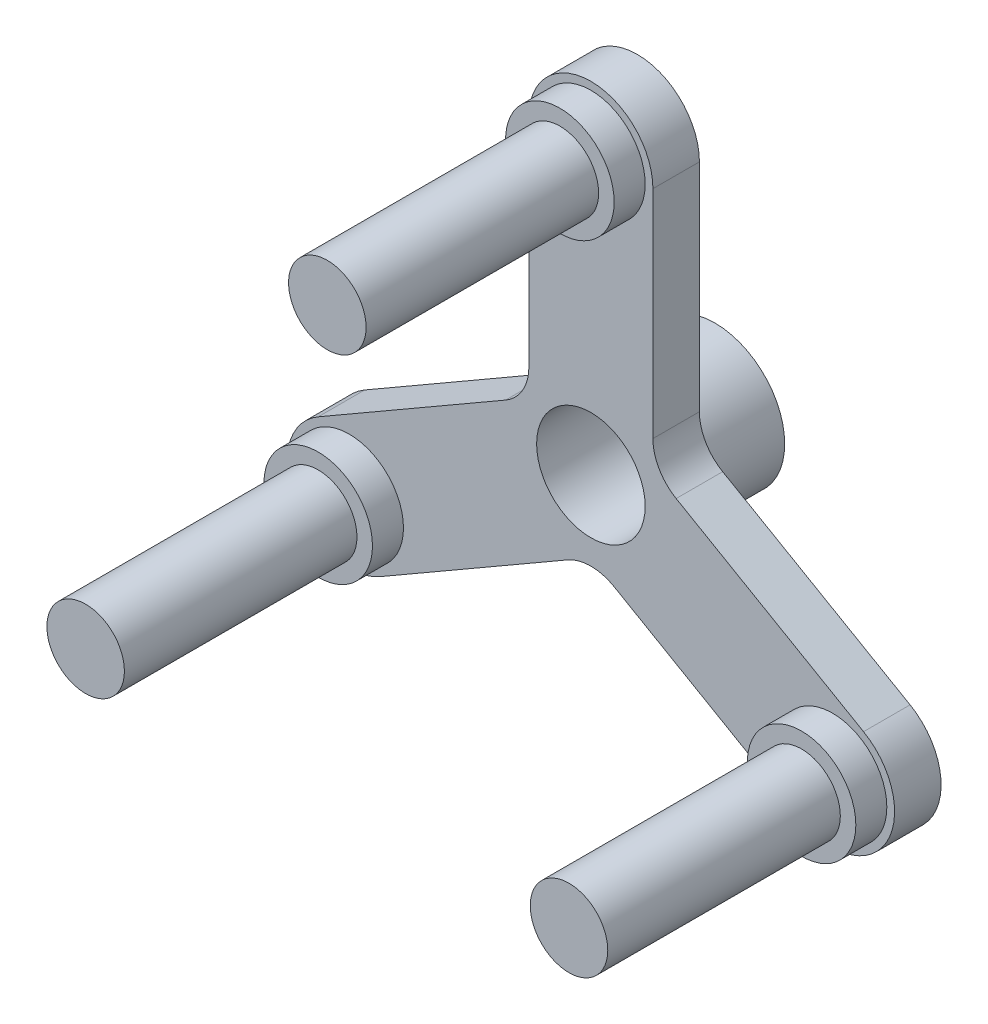
ISO-10303-21;
HEADER;
FILE_DESCRIPTION(('STEP AP214'),'2;1');
FILE_NAME('part.step','',(''),(''),'','','');
FILE_SCHEMA(('AUTOMOTIVE_DESIGN { 1 0 10303 214 1 1 1 1 }'));
ENDSEC;
DATA;
#1=APPLICATION_CONTEXT('core data for automotive mechanical design processes');
#2=APPLICATION_PROTOCOL_DEFINITION('international standard','automotive_design',2000,#1);
#3=PRODUCT_CONTEXT('',#1,'mechanical');
#4=PRODUCT('Part','Part','',(#3));
#5=PRODUCT_RELATED_PRODUCT_CATEGORY('part','',(#4));
#6=PRODUCT_DEFINITION_FORMATION('','',#4);
#7=PRODUCT_DEFINITION_CONTEXT('part definition',#1,'design');
#8=PRODUCT_DEFINITION('design','',#6,#7);
#9=PRODUCT_DEFINITION_SHAPE('','',#8);
#10=(LENGTH_UNIT() NAMED_UNIT(*) SI_UNIT(.MILLI.,.METRE.));
#11=(NAMED_UNIT(*) PLANE_ANGLE_UNIT() SI_UNIT($,.RADIAN.));
#12=(NAMED_UNIT(*) SI_UNIT($,.STERADIAN.) SOLID_ANGLE_UNIT());
#13=UNCERTAINTY_MEASURE_WITH_UNIT(LENGTH_MEASURE(1.E-05),#10,'distance_accuracy_value','');
#14=(GEOMETRIC_REPRESENTATION_CONTEXT(3) GLOBAL_UNCERTAINTY_ASSIGNED_CONTEXT((#13)) GLOBAL_UNIT_ASSIGNED_CONTEXT((#10,
#11,#12)) REPRESENTATION_CONTEXT('',''));
#15=CARTESIAN_POINT('',(0.,0.,0.));
#16=DIRECTION('',(0.,0.,1.));
#17=DIRECTION('',(1.,0.,0.));
#18=AXIS2_PLACEMENT_3D('',#15,#16,#17);
#19=CARTESIAN_POINT('',(0.,0.,0.));
#20=DIRECTION('',(0.,0.,1.));
#21=DIRECTION('',(1.,0.,0.));
#22=AXIS2_PLACEMENT_3D('',#19,#20,#21);
#23=PLANE('',#22);
#24=DIRECTION('',(-0.866025403784436,-0.500000000000004,0.));
#25=VECTOR('',#24,1.);
#26=CARTESIAN_POINT('',(-2.00000000000002,3.46410161513775,0.));
#27=LINE('',#26,#25);
#28=CARTESIAN_POINT('',(-5.49999999999999,1.44337567297405,0.));
#29=VERTEX_POINT('',#28);
#30=CARTESIAN_POINT('',(-17.5884572681199,-5.53589838486233,0.));
#31=VERTEX_POINT('',#30);
#32=EDGE_CURVE('E147',#29,#31,#27,.T.);
#33=ORIENTED_EDGE('',*,*,#32,.F.);
#34=CARTESIAN_POINT('',(-7.,4.04145188432736,0.));
#35=DIRECTION('',(0.,0.,1.));
#36=DIRECTION('',(1.,0.,0.));
#37=AXIS2_PLACEMENT_3D('',#34,#35,#36);
#38=CIRCLE('',#37,3.);
#39=CARTESIAN_POINT('',(-4.,4.04145188432736,0.));
#40=VERTEX_POINT('',#39);
#41=EDGE_CURVE('E49',#29,#40,#38,.T.);
#42=ORIENTED_EDGE('',*,*,#41,.T.);
#43=DIRECTION('',(0.,-1.,0.));
#44=VECTOR('',#43,1.);
#45=CARTESIAN_POINT('',(-4.,0.,0.));
#46=LINE('',#45,#44);
#47=CARTESIAN_POINT('',(-4.,18.,0.));
#48=VERTEX_POINT('',#47);
#49=EDGE_CURVE('E204',#48,#40,#46,.T.);
#50=ORIENTED_EDGE('',*,*,#49,.F.);
#51=CARTESIAN_POINT('',(0.,18.,0.));
#52=DIRECTION('',(0.,0.,1.));
#53=DIRECTION('',(1.,0.,0.));
#54=AXIS2_PLACEMENT_3D('',#51,#52,#53);
#55=CIRCLE('',#54,4.);
#56=CARTESIAN_POINT('',(4.,18.,0.));
#57=VERTEX_POINT('',#56);
#58=EDGE_CURVE('E210',#57,#48,#55,.T.);
#59=ORIENTED_EDGE('',*,*,#58,.F.);
#60=DIRECTION('',(0.,1.,0.));
#61=VECTOR('',#60,1.);
#62=CARTESIAN_POINT('',(4.,0.,0.));
#63=LINE('',#62,#61);
#64=CARTESIAN_POINT('',(4.,4.04145188432742,0.));
#65=VERTEX_POINT('',#64);
#66=EDGE_CURVE('E200',#65,#57,#63,.T.);
#67=ORIENTED_EDGE('',*,*,#66,.F.);
#68=CARTESIAN_POINT('',(7.,4.04145188432742,0.));
#69=DIRECTION('',(0.,0.,1.));
#70=DIRECTION('',(1.,0.,0.));
#71=AXIS2_PLACEMENT_3D('',#68,#69,#70);
#72=CIRCLE('',#71,3.);
#73=CARTESIAN_POINT('',(5.50000000000003,1.44337567297409,0.));
#74=VERTEX_POINT('',#73);
#75=EDGE_CURVE('E233',#65,#74,#72,.T.);
#76=ORIENTED_EDGE('',*,*,#75,.T.);
#77=DIRECTION('',(-0.866025403784443,0.499999999999992,0.));
#78=VECTOR('',#77,1.);
#79=CARTESIAN_POINT('',(1.99999999999997,3.46410161513777,0.));
#80=LINE('',#79,#78);
#81=CARTESIAN_POINT('',(17.5884572681199,-5.53589838486208,0.));
#82=VERTEX_POINT('',#81);
#83=EDGE_CURVE('E138',#82,#74,#80,.T.);
#84=ORIENTED_EDGE('',*,*,#83,.F.);
#85=CARTESIAN_POINT('',(15.58845726812,-8.99999999999985,0.));
#86=DIRECTION('',(0.,0.,1.));
#87=DIRECTION('',(-0.499999999999992,-0.866025403784443,0.));
#88=AXIS2_PLACEMENT_3D('',#85,#86,#87);
#89=CIRCLE('',#88,4.);
#90=CARTESIAN_POINT('',(13.58845726812,-12.4641016151376,0.));
#91=VERTEX_POINT('',#90);
#92=EDGE_CURVE('E159',#91,#82,#89,.T.);
#93=ORIENTED_EDGE('',*,*,#92,.F.);
#94=DIRECTION('',(0.866025403784443,-0.499999999999992,0.));
#95=VECTOR('',#94,1.);
#96=CARTESIAN_POINT('',(-1.99999999999997,-3.46410161513777,0.));
#97=LINE('',#96,#95);
#98=CARTESIAN_POINT('',(1.50000000000003,-5.48482755730142,0.));
#99=VERTEX_POINT('',#98);
#100=EDGE_CURVE('E144',#99,#91,#97,.T.);
#101=ORIENTED_EDGE('',*,*,#100,.F.);
#102=CARTESIAN_POINT('',(0.,-8.08290376865475,0.));
#103=DIRECTION('',(0.,0.,1.));
#104=DIRECTION('',(1.,0.,0.));
#105=AXIS2_PLACEMENT_3D('',#102,#103,#104);
#106=CIRCLE('',#105,3.);
#107=CARTESIAN_POINT('',(-1.49999999999996,-5.48482755730144,0.));
#108=VERTEX_POINT('',#107);
#109=EDGE_CURVE('E235',#99,#108,#106,.T.);
#110=ORIENTED_EDGE('',*,*,#109,.T.);
#111=DIRECTION('',(0.866025403784436,0.500000000000004,0.));
#112=VECTOR('',#111,1.);
#113=CARTESIAN_POINT('',(2.00000000000002,-3.46410161513775,0.));
#114=LINE('',#113,#112);
#115=CARTESIAN_POINT('',(-13.5884572681198,-12.4641016151378,0.));
#116=VERTEX_POINT('',#115);
#117=EDGE_CURVE('E168',#116,#108,#114,.T.);
#118=ORIENTED_EDGE('',*,*,#117,.F.);
#119=CARTESIAN_POINT('',(-15.5884572681199,-9.00000000000007,0.));
#120=DIRECTION('',(0.,0.,1.));
#121=DIRECTION('',(-0.500000000000004,0.866025403784436,0.));
#122=AXIS2_PLACEMENT_3D('',#119,#120,#121);
#123=CIRCLE('',#122,4.);
#124=EDGE_CURVE('E174',#31,#116,#123,.T.);
#125=ORIENTED_EDGE('',*,*,#124,.F.);
#126=EDGE_LOOP('',(#33,#42,#50,#59,#67,#76,#84,#93,#101,#110,#118,#125));
#127=FACE_BOUND('',#126,.T.);
#128=CARTESIAN_POINT('',(0.,0.,0.));
#129=DIRECTION('',(0.,0.,1.));
#130=DIRECTION('',(1.,0.,0.));
#131=AXIS2_PLACEMENT_3D('',#128,#129,#130);
#132=CIRCLE('',#131,4.5);
#133=CARTESIAN_POINT('',(4.5,0.,0.));
#134=VERTEX_POINT('',#133);
#135=EDGE_CURVE('E11',#134,#134,#132,.F.);
#136=ORIENTED_EDGE('',*,*,#135,.F.);
#137=EDGE_LOOP('',(#136));
#138=FACE_BOUND('',#137,.T.);
#139=ADVANCED_FACE('F34',(#127,#138),#23,.F.);
#140=CARTESIAN_POINT('',(4.,0.,3.));
#141=DIRECTION('',(-1.,0.,0.));
#142=DIRECTION('',(0.,0.,1.));
#143=AXIS2_PLACEMENT_3D('',#140,#141,#142);
#144=PLANE('',#143);
#145=DIRECTION('',(0.,1.,0.));
#146=VECTOR('',#145,1.);
#147=CARTESIAN_POINT('',(4.,0.,3.));
#148=LINE('',#147,#146);
#149=CARTESIAN_POINT('',(4.,4.04145188432742,3.));
#150=VERTEX_POINT('',#149);
#151=CARTESIAN_POINT('',(4.,18.,3.));
#152=VERTEX_POINT('',#151);
#153=EDGE_CURVE('E201',#150,#152,#148,.T.);
#154=ORIENTED_EDGE('',*,*,#153,.F.);
#155=DIRECTION('',(0.,0.,1.));
#156=VECTOR('',#155,1.);
#157=CARTESIAN_POINT('',(4.,4.04145188432742,0.));
#158=LINE('',#157,#156);
#159=EDGE_CURVE('E220',#150,#65,#158,.F.);
#160=ORIENTED_EDGE('',*,*,#159,.T.);
#161=ORIENTED_EDGE('',*,*,#66,.T.);
#162=DIRECTION('',(0.,0.,-1.));
#163=VECTOR('',#162,1.);
#164=CARTESIAN_POINT('',(4.,18.,3.));
#165=LINE('',#164,#163);
#166=EDGE_CURVE('E191',#152,#57,#165,.T.);
#167=ORIENTED_EDGE('',*,*,#166,.F.);
#168=EDGE_LOOP('',(#154,#160,#161,#167));
#169=FACE_BOUND('',#168,.T.);
#170=ADVANCED_FACE('F259',(#169),#144,.F.);
#171=CARTESIAN_POINT('',(-4.,0.,3.));
#172=DIRECTION('',(1.,0.,0.));
#173=DIRECTION('',(0.,0.,-1.));
#174=AXIS2_PLACEMENT_3D('',#171,#172,#173);
#175=PLANE('',#174);
#176=ORIENTED_EDGE('',*,*,#49,.T.);
#177=DIRECTION('',(0.,0.,-1.));
#178=VECTOR('',#177,1.);
#179=CARTESIAN_POINT('',(-4.,4.04145188432736,3.));
#180=LINE('',#179,#178);
#181=CARTESIAN_POINT('',(-4.,4.04145188432736,3.));
#182=VERTEX_POINT('',#181);
#183=EDGE_CURVE('E56',#40,#182,#180,.F.);
#184=ORIENTED_EDGE('',*,*,#183,.T.);
#185=DIRECTION('',(0.,-1.,0.));
#186=VECTOR('',#185,1.);
#187=CARTESIAN_POINT('',(-4.,0.,3.));
#188=LINE('',#187,#186);
#189=CARTESIAN_POINT('',(-4.,18.,3.));
#190=VERTEX_POINT('',#189);
#191=EDGE_CURVE('E206',#190,#182,#188,.T.);
#192=ORIENTED_EDGE('',*,*,#191,.F.);
#193=DIRECTION('',(0.,0.,-1.));
#194=VECTOR('',#193,1.);
#195=CARTESIAN_POINT('',(-4.,18.,3.));
#196=LINE('',#195,#194);
#197=EDGE_CURVE('E208',#190,#48,#196,.T.);
#198=ORIENTED_EDGE('',*,*,#197,.T.);
#199=EDGE_LOOP('',(#176,#184,#192,#198));
#200=FACE_BOUND('',#199,.T.);
#201=ADVANCED_FACE('F264',(#200),#175,.F.);
#202=CARTESIAN_POINT('',(0.,0.,3.));
#203=DIRECTION('',(0.,0.,1.));
#204=DIRECTION('',(1.,0.,0.));
#205=AXIS2_PLACEMENT_3D('',#202,#203,#204);
#206=PLANE('',#205);
#207=CARTESIAN_POINT('',(15.58845726812,-8.99999999999985,3.));
#208=DIRECTION('',(0.,0.,1.));
#209=DIRECTION('',(-0.499999999999992,-0.866025403784443,0.));
#210=AXIS2_PLACEMENT_3D('',#207,#208,#209);
#211=CIRCLE('',#210,3.5);
#212=CARTESIAN_POINT('',(13.83845726812,-12.0310889132454,3.));
#213=VERTEX_POINT('',#212);
#214=EDGE_CURVE('E359',#213,#213,#211,.T.);
#215=ORIENTED_EDGE('',*,*,#214,.F.);
#216=EDGE_LOOP('',(#215));
#217=FACE_BOUND('',#216,.T.);
#218=CARTESIAN_POINT('',(-15.5884572681199,-9.00000000000007,3.));
#219=DIRECTION('',(0.,0.,1.));
#220=DIRECTION('',(-0.500000000000004,0.866025403784436,0.));
#221=AXIS2_PLACEMENT_3D('',#218,#219,#220);
#222=CIRCLE('',#221,3.5);
#223=CARTESIAN_POINT('',(-17.3384572681199,-5.96891108675455,3.));
#224=VERTEX_POINT('',#223);
#225=EDGE_CURVE('E365',#224,#224,#222,.T.);
#226=ORIENTED_EDGE('',*,*,#225,.F.);
#227=EDGE_LOOP('',(#226));
#228=FACE_BOUND('',#227,.T.);
#229=DIRECTION('',(-0.866025403784443,0.499999999999992,0.));
#230=VECTOR('',#229,1.);
#231=CARTESIAN_POINT('',(1.99999999999997,3.46410161513777,3.));
#232=LINE('',#231,#230);
#233=CARTESIAN_POINT('',(17.5884572681199,-5.53589838486208,3.));
#234=VERTEX_POINT('',#233);
#235=CARTESIAN_POINT('',(5.50000000000003,1.44337567297409,3.));
#236=VERTEX_POINT('',#235);
#237=EDGE_CURVE('E153',#234,#236,#232,.T.);
#238=ORIENTED_EDGE('',*,*,#237,.T.);
#239=CARTESIAN_POINT('',(7.,4.04145188432742,3.));
#240=DIRECTION('',(0.,0.,1.));
#241=DIRECTION('',(1.,0.,0.));
#242=AXIS2_PLACEMENT_3D('',#239,#240,#241);
#243=CIRCLE('',#242,3.);
#244=EDGE_CURVE('E231',#236,#150,#243,.F.);
#245=ORIENTED_EDGE('',*,*,#244,.T.);
#246=ORIENTED_EDGE('',*,*,#153,.T.);
#247=CARTESIAN_POINT('',(0.,18.,3.));
#248=DIRECTION('',(0.,0.,1.));
#249=DIRECTION('',(1.,0.,0.));
#250=AXIS2_PLACEMENT_3D('',#247,#248,#249);
#251=CIRCLE('',#250,4.);
#252=EDGE_CURVE('E203',#152,#190,#251,.T.);
#253=ORIENTED_EDGE('',*,*,#252,.T.);
#254=ORIENTED_EDGE('',*,*,#191,.T.);
#255=CARTESIAN_POINT('',(-7.,4.04145188432736,3.));
#256=DIRECTION('',(0.,0.,1.));
#257=DIRECTION('',(1.,0.,0.));
#258=AXIS2_PLACEMENT_3D('',#255,#256,#257);
#259=CIRCLE('',#258,3.);
#260=CARTESIAN_POINT('',(-5.49999999999999,1.44337567297405,3.));
#261=VERTEX_POINT('',#260);
#262=EDGE_CURVE('E42',#182,#261,#259,.F.);
#263=ORIENTED_EDGE('',*,*,#262,.T.);
#264=DIRECTION('',(-0.866025403784436,-0.500000000000004,0.));
#265=VECTOR('',#264,1.);
#266=CARTESIAN_POINT('',(-2.00000000000002,3.46410161513775,3.));
#267=LINE('',#266,#265);
#268=CARTESIAN_POINT('',(-17.5884572681199,-5.53589838486233,3.));
#269=VERTEX_POINT('',#268);
#270=EDGE_CURVE('E165',#261,#269,#267,.T.);
#271=ORIENTED_EDGE('',*,*,#270,.T.);
#272=CARTESIAN_POINT('',(-15.5884572681199,-9.00000000000007,3.));
#273=DIRECTION('',(0.,0.,1.));
#274=DIRECTION('',(-0.500000000000004,0.866025403784436,0.));
#275=AXIS2_PLACEMENT_3D('',#272,#273,#274);
#276=CIRCLE('',#275,4.);
#277=CARTESIAN_POINT('',(-13.5884572681198,-12.4641016151378,3.));
#278=VERTEX_POINT('',#277);
#279=EDGE_CURVE('E167',#269,#278,#276,.T.);
#280=ORIENTED_EDGE('',*,*,#279,.T.);
#281=DIRECTION('',(0.866025403784436,0.500000000000004,0.));
#282=VECTOR('',#281,1.);
#283=CARTESIAN_POINT('',(2.00000000000002,-3.46410161513775,3.));
#284=LINE('',#283,#282);
#285=CARTESIAN_POINT('',(-1.49999999999996,-5.48482755730144,3.));
#286=VERTEX_POINT('',#285);
#287=EDGE_CURVE('E170',#278,#286,#284,.T.);
#288=ORIENTED_EDGE('',*,*,#287,.T.);
#289=CARTESIAN_POINT('',(0.,-8.08290376865475,3.));
#290=DIRECTION('',(0.,0.,1.));
#291=DIRECTION('',(1.,0.,0.));
#292=AXIS2_PLACEMENT_3D('',#289,#290,#291);
#293=CIRCLE('',#292,3.);
#294=CARTESIAN_POINT('',(1.50000000000003,-5.48482755730142,3.));
#295=VERTEX_POINT('',#294);
#296=EDGE_CURVE('E134',#286,#295,#293,.F.);
#297=ORIENTED_EDGE('',*,*,#296,.T.);
#298=DIRECTION('',(0.866025403784443,-0.499999999999992,0.));
#299=VECTOR('',#298,1.);
#300=CARTESIAN_POINT('',(-1.99999999999997,-3.46410161513777,3.));
#301=LINE('',#300,#299);
#302=CARTESIAN_POINT('',(13.58845726812,-12.4641016151376,3.));
#303=VERTEX_POINT('',#302);
#304=EDGE_CURVE('E124',#295,#303,#301,.T.);
#305=ORIENTED_EDGE('',*,*,#304,.T.);
#306=CARTESIAN_POINT('',(15.58845726812,-8.99999999999985,3.));
#307=DIRECTION('',(0.,0.,1.));
#308=DIRECTION('',(-0.499999999999992,-0.866025403784443,0.));
#309=AXIS2_PLACEMENT_3D('',#306,#307,#308);
#310=CIRCLE('',#309,4.);
#311=EDGE_CURVE('E130',#303,#234,#310,.T.);
#312=ORIENTED_EDGE('',*,*,#311,.T.);
#313=EDGE_LOOP('',(#238,#245,#246,#253,#254,#263,#271,#280,#288,#297,#305,#312));
#314=FACE_BOUND('',#313,.T.);
#315=CARTESIAN_POINT('',(0.,0.,3.));
#316=DIRECTION('',(0.,0.,1.));
#317=DIRECTION('',(1.,0.,0.));
#318=AXIS2_PLACEMENT_3D('',#315,#316,#317);
#319=CIRCLE('',#318,3.5);
#320=CARTESIAN_POINT('',(3.5,0.,3.));
#321=VERTEX_POINT('',#320);
#322=EDGE_CURVE('E195',#321,#321,#319,.T.);
#323=ORIENTED_EDGE('',*,*,#322,.F.);
#324=EDGE_LOOP('',(#323));
#325=FACE_BOUND('',#324,.T.);
#326=CARTESIAN_POINT('',(0.,18.,3.));
#327=DIRECTION('',(0.,0.,1.));
#328=DIRECTION('',(1.,0.,0.));
#329=AXIS2_PLACEMENT_3D('',#326,#327,#328);
#330=CIRCLE('',#329,3.5);
#331=CARTESIAN_POINT('',(3.5,18.,3.));
#332=VERTEX_POINT('',#331);
#333=EDGE_CURVE('E186',#332,#332,#330,.T.);
#334=ORIENTED_EDGE('',*,*,#333,.F.);
#335=EDGE_LOOP('',(#334));
#336=FACE_BOUND('',#335,.T.);
#337=ADVANCED_FACE('F127',(#217,#228,#314,#325,#336),#206,.T.);
#338=CARTESIAN_POINT('',(0.,18.,3.));
#339=DIRECTION('',(0.,0.,-1.));
#340=DIRECTION('',(-1.,0.,0.));
#341=AXIS2_PLACEMENT_3D('',#338,#339,#340);
#342=CYLINDRICAL_SURFACE('',#341,4.);
#343=ORIENTED_EDGE('',*,*,#58,.T.);
#344=ORIENTED_EDGE('',*,*,#197,.F.);
#345=ORIENTED_EDGE('',*,*,#252,.F.);
#346=ORIENTED_EDGE('',*,*,#166,.T.);
#347=EDGE_LOOP('',(#343,#344,#345,#346));
#348=FACE_BOUND('',#347,.T.);
#349=ADVANCED_FACE('F273',(#348),#342,.T.);
#350=CARTESIAN_POINT('',(0.,0.,3.));
#351=DIRECTION('',(0.,0.,-1.));
#352=DIRECTION('',(-1.,0.,0.));
#353=AXIS2_PLACEMENT_3D('',#350,#351,#352);
#354=CYLINDRICAL_SURFACE('',#353,3.5);
#355=ORIENTED_EDGE('',*,*,#322,.T.);
#356=EDGE_LOOP('',(#355));
#357=FACE_BOUND('',#356,.T.);
#358=CARTESIAN_POINT('',(0.,0.,-5.));
#359=DIRECTION('',(0.,0.,-1.));
#360=DIRECTION('',(-1.,0.,0.));
#361=AXIS2_PLACEMENT_3D('',#358,#359,#360);
#362=CIRCLE('',#361,3.5);
#363=CARTESIAN_POINT('',(-3.5,0.,-5.));
#364=VERTEX_POINT('',#363);
#365=EDGE_CURVE('E344',#364,#364,#362,.T.);
#366=ORIENTED_EDGE('',*,*,#365,.T.);
#367=EDGE_LOOP('',(#366));
#368=FACE_BOUND('',#367,.T.);
#369=ADVANCED_FACE('F275',(#357,#368),#354,.F.);
#370=CARTESIAN_POINT('',(0.,18.,5.));
#371=DIRECTION('',(0.,0.,-1.));
#372=DIRECTION('',(-1.,0.,0.));
#373=AXIS2_PLACEMENT_3D('',#370,#371,#372);
#374=CYLINDRICAL_SURFACE('',#373,3.5);
#375=CARTESIAN_POINT('',(0.,18.,5.));
#376=DIRECTION('',(0.,0.,1.));
#377=DIRECTION('',(1.,0.,0.));
#378=AXIS2_PLACEMENT_3D('',#375,#376,#377);
#379=CIRCLE('',#378,3.5);
#380=CARTESIAN_POINT('',(3.5,18.,5.));
#381=VERTEX_POINT('',#380);
#382=EDGE_CURVE('E192',#381,#381,#379,.T.);
#383=ORIENTED_EDGE('',*,*,#382,.F.);
#384=EDGE_LOOP('',(#383));
#385=FACE_BOUND('',#384,.T.);
#386=ORIENTED_EDGE('',*,*,#333,.T.);
#387=EDGE_LOOP('',(#386));
#388=FACE_BOUND('',#387,.T.);
#389=ADVANCED_FACE('F332',(#385,#388),#374,.T.);
#390=CARTESIAN_POINT('',(0.,18.,5.));
#391=DIRECTION('',(0.,0.,1.));
#392=DIRECTION('',(1.,0.,0.));
#393=AXIS2_PLACEMENT_3D('',#390,#391,#392);
#394=PLANE('',#393);
#395=CARTESIAN_POINT('',(0.,18.,5.));
#396=DIRECTION('',(0.,0.,1.));
#397=DIRECTION('',(1.,0.,0.));
#398=AXIS2_PLACEMENT_3D('',#395,#396,#397);
#399=CIRCLE('',#398,2.5);
#400=CARTESIAN_POINT('',(2.5,18.,5.));
#401=VERTEX_POINT('',#400);
#402=EDGE_CURVE('E187',#401,#401,#399,.T.);
#403=ORIENTED_EDGE('',*,*,#402,.F.);
#404=EDGE_LOOP('',(#403));
#405=FACE_BOUND('',#404,.T.);
#406=ORIENTED_EDGE('',*,*,#382,.T.);
#407=EDGE_LOOP('',(#406));
#408=FACE_BOUND('',#407,.T.);
#409=ADVANCED_FACE('F328',(#405,#408),#394,.T.);
#410=CARTESIAN_POINT('',(0.,18.,20.));
#411=DIRECTION('',(0.,0.,-1.));
#412=DIRECTION('',(-1.,0.,0.));
#413=AXIS2_PLACEMENT_3D('',#410,#411,#412);
#414=CYLINDRICAL_SURFACE('',#413,2.5);
#415=CARTESIAN_POINT('',(0.,18.,20.));
#416=DIRECTION('',(0.,0.,1.));
#417=DIRECTION('',(1.,0.,0.));
#418=AXIS2_PLACEMENT_3D('',#415,#416,#417);
#419=CIRCLE('',#418,2.5);
#420=CARTESIAN_POINT('',(2.5,18.,20.));
#421=VERTEX_POINT('',#420);
#422=EDGE_CURVE('E183',#421,#421,#419,.T.);
#423=ORIENTED_EDGE('',*,*,#422,.F.);
#424=EDGE_LOOP('',(#423));
#425=FACE_BOUND('',#424,.T.);
#426=ORIENTED_EDGE('',*,*,#402,.T.);
#427=EDGE_LOOP('',(#426));
#428=FACE_BOUND('',#427,.T.);
#429=ADVANCED_FACE('F308',(#425,#428),#414,.T.);
#430=CARTESIAN_POINT('',(0.,18.,20.));
#431=DIRECTION('',(0.,0.,1.));
#432=DIRECTION('',(1.,0.,0.));
#433=AXIS2_PLACEMENT_3D('',#430,#431,#432);
#434=PLANE('',#433);
#435=ORIENTED_EDGE('',*,*,#422,.T.);
#436=EDGE_LOOP('',(#435));
#437=FACE_BOUND('',#436,.T.);
#438=ADVANCED_FACE('F300',(#437),#434,.T.);
#439=CARTESIAN_POINT('',(1.99999999999997,3.46410161513777,3.));
#440=DIRECTION('',(-0.499999999999992,-0.866025403784443,0.));
#441=DIRECTION('',(0.866025403784443,-0.499999999999992,0.));
#442=AXIS2_PLACEMENT_3D('',#439,#440,#441);
#443=PLANE('',#442);
#444=ORIENTED_EDGE('',*,*,#83,.T.);
#445=DIRECTION('',(0.,0.,1.));
#446=VECTOR('',#445,1.);
#447=CARTESIAN_POINT('',(5.50000000000003,1.44337567297409,3.));
#448=LINE('',#447,#446);
#449=EDGE_CURVE('E217',#74,#236,#448,.T.);
#450=ORIENTED_EDGE('',*,*,#449,.T.);
#451=ORIENTED_EDGE('',*,*,#237,.F.);
#452=DIRECTION('',(0.,0.,-1.));
#453=VECTOR('',#452,1.);
#454=CARTESIAN_POINT('',(17.5884572681199,-5.53589838486208,3.));
#455=LINE('',#454,#453);
#456=EDGE_CURVE('E148',#234,#82,#455,.T.);
#457=ORIENTED_EDGE('',*,*,#456,.T.);
#458=EDGE_LOOP('',(#444,#450,#451,#457));
#459=FACE_BOUND('',#458,.T.);
#460=ADVANCED_FACE('F294',(#459),#443,.F.);
#461=CARTESIAN_POINT('',(-2.00000000000002,3.46410161513775,3.));
#462=DIRECTION('',(0.500000000000004,-0.866025403784436,0.));
#463=DIRECTION('',(0.866025403784436,0.500000000000004,0.));
#464=AXIS2_PLACEMENT_3D('',#461,#462,#463);
#465=PLANE('',#464);
#466=ORIENTED_EDGE('',*,*,#270,.F.);
#467=DIRECTION('',(0.,0.,-1.));
#468=VECTOR('',#467,1.);
#469=CARTESIAN_POINT('',(-5.49999999999999,1.44337567297405,0.));
#470=LINE('',#469,#468);
#471=EDGE_CURVE('E227',#261,#29,#470,.T.);
#472=ORIENTED_EDGE('',*,*,#471,.T.);
#473=ORIENTED_EDGE('',*,*,#32,.T.);
#474=DIRECTION('',(0.,0.,-1.));
#475=VECTOR('',#474,1.);
#476=CARTESIAN_POINT('',(-17.5884572681199,-5.53589838486233,3.));
#477=LINE('',#476,#475);
#478=EDGE_CURVE('E180',#269,#31,#477,.T.);
#479=ORIENTED_EDGE('',*,*,#478,.F.);
#480=EDGE_LOOP('',(#466,#472,#473,#479));
#481=FACE_BOUND('',#480,.T.);
#482=ADVANCED_FACE('F244',(#481),#465,.F.);
#483=CARTESIAN_POINT('',(2.00000000000002,-3.46410161513775,3.));
#484=DIRECTION('',(-0.500000000000004,0.866025403784436,0.));
#485=DIRECTION('',(-0.866025403784436,-0.500000000000004,0.));
#486=AXIS2_PLACEMENT_3D('',#483,#484,#485);
#487=PLANE('',#486);
#488=ORIENTED_EDGE('',*,*,#117,.T.);
#489=DIRECTION('',(0.,0.,-1.));
#490=VECTOR('',#489,1.);
#491=CARTESIAN_POINT('',(-1.49999999999995,-5.48482755730144,3.));
#492=LINE('',#491,#490);
#493=EDGE_CURVE('E225',#108,#286,#492,.F.);
#494=ORIENTED_EDGE('',*,*,#493,.T.);
#495=ORIENTED_EDGE('',*,*,#287,.F.);
#496=DIRECTION('',(0.,0.,-1.));
#497=VECTOR('',#496,1.);
#498=CARTESIAN_POINT('',(-13.5884572681198,-12.4641016151378,3.));
#499=LINE('',#498,#497);
#500=EDGE_CURVE('E172',#278,#116,#499,.T.);
#501=ORIENTED_EDGE('',*,*,#500,.T.);
#502=EDGE_LOOP('',(#488,#494,#495,#501));
#503=FACE_BOUND('',#502,.T.);
#504=ADVANCED_FACE('F306',(#503),#487,.F.);
#505=CARTESIAN_POINT('',(-15.5884572681199,-9.00000000000007,3.));
#506=DIRECTION('',(0.,0.,-1.));
#507=DIRECTION('',(-1.,0.,0.));
#508=AXIS2_PLACEMENT_3D('',#505,#506,#507);
#509=CYLINDRICAL_SURFACE('',#508,4.);
#510=ORIENTED_EDGE('',*,*,#124,.T.);
#511=ORIENTED_EDGE('',*,*,#500,.F.);
#512=ORIENTED_EDGE('',*,*,#279,.F.);
#513=ORIENTED_EDGE('',*,*,#478,.T.);
#514=EDGE_LOOP('',(#510,#511,#512,#513));
#515=FACE_BOUND('',#514,.T.);
#516=ADVANCED_FACE('F319',(#515),#509,.T.);
#517=CARTESIAN_POINT('',(-1.99999999999997,-3.46410161513777,3.));
#518=DIRECTION('',(0.499999999999992,0.866025403784443,0.));
#519=DIRECTION('',(-0.866025403784443,0.499999999999992,0.));
#520=AXIS2_PLACEMENT_3D('',#517,#518,#519);
#521=PLANE('',#520);
#522=ORIENTED_EDGE('',*,*,#304,.F.);
#523=DIRECTION('',(0.,0.,-1.));
#524=VECTOR('',#523,1.);
#525=CARTESIAN_POINT('',(1.50000000000003,-5.48482755730142,0.));
#526=LINE('',#525,#524);
#527=EDGE_CURVE('E223',#295,#99,#526,.T.);
#528=ORIENTED_EDGE('',*,*,#527,.T.);
#529=ORIENTED_EDGE('',*,*,#100,.T.);
#530=DIRECTION('',(0.,0.,-1.));
#531=VECTOR('',#530,1.);
#532=CARTESIAN_POINT('',(13.58845726812,-12.4641016151376,3.));
#533=LINE('',#532,#531);
#534=EDGE_CURVE('E141',#303,#91,#533,.T.);
#535=ORIENTED_EDGE('',*,*,#534,.F.);
#536=EDGE_LOOP('',(#522,#528,#529,#535));
#537=FACE_BOUND('',#536,.T.);
#538=ADVANCED_FACE('F142',(#537),#521,.F.);
#539=CARTESIAN_POINT('',(15.58845726812,-8.99999999999985,3.));
#540=DIRECTION('',(0.,0.,-1.));
#541=DIRECTION('',(-1.,0.,0.));
#542=AXIS2_PLACEMENT_3D('',#539,#540,#541);
#543=CYLINDRICAL_SURFACE('',#542,4.);
#544=ORIENTED_EDGE('',*,*,#92,.T.);
#545=ORIENTED_EDGE('',*,*,#456,.F.);
#546=ORIENTED_EDGE('',*,*,#311,.F.);
#547=ORIENTED_EDGE('',*,*,#534,.T.);
#548=EDGE_LOOP('',(#544,#545,#546,#547));
#549=FACE_BOUND('',#548,.T.);
#550=ADVANCED_FACE('F150',(#549),#543,.T.);
#551=CARTESIAN_POINT('',(-15.5884572681199,-9.00000000000007,5.));
#552=DIRECTION('',(0.,0.,-1.));
#553=DIRECTION('',(-1.,0.,0.));
#554=AXIS2_PLACEMENT_3D('',#551,#552,#553);
#555=CYLINDRICAL_SURFACE('',#554,3.5);
#556=CARTESIAN_POINT('',(-15.5884572681199,-9.00000000000007,5.));
#557=DIRECTION('',(0.,0.,1.));
#558=DIRECTION('',(-0.500000000000004,0.866025403784436,0.));
#559=AXIS2_PLACEMENT_3D('',#556,#557,#558);
#560=CIRCLE('',#559,3.5);
#561=CARTESIAN_POINT('',(-17.3384572681199,-5.96891108675455,5.));
#562=VERTEX_POINT('',#561);
#563=EDGE_CURVE('E160',#562,#562,#560,.T.);
#564=ORIENTED_EDGE('',*,*,#563,.F.);
#565=EDGE_LOOP('',(#564));
#566=FACE_BOUND('',#565,.T.);
#567=ORIENTED_EDGE('',*,*,#225,.T.);
#568=EDGE_LOOP('',(#567));
#569=FACE_BOUND('',#568,.T.);
#570=ADVANCED_FACE('F313',(#566,#569),#555,.T.);
#571=CARTESIAN_POINT('',(-15.5884572681199,-9.00000000000007,5.));
#572=DIRECTION('',(0.,0.,1.));
#573=DIRECTION('',(-0.500000000000004,0.866025403784436,0.));
#574=AXIS2_PLACEMENT_3D('',#571,#572,#573);
#575=PLANE('',#574);
#576=CARTESIAN_POINT('',(-15.5884572681199,-9.00000000000007,5.));
#577=DIRECTION('',(0.,0.,1.));
#578=DIRECTION('',(-0.500000000000004,0.866025403784436,0.));
#579=AXIS2_PLACEMENT_3D('',#576,#577,#578);
#580=CIRCLE('',#579,2.5);
#581=CARTESIAN_POINT('',(-16.8384572681199,-6.83493649053898,5.));
#582=VERTEX_POINT('',#581);
#583=EDGE_CURVE('E190',#582,#582,#580,.T.);
#584=ORIENTED_EDGE('',*,*,#583,.F.);
#585=EDGE_LOOP('',(#584));
#586=FACE_BOUND('',#585,.T.);
#587=ORIENTED_EDGE('',*,*,#563,.T.);
#588=EDGE_LOOP('',(#587));
#589=FACE_BOUND('',#588,.T.);
#590=ADVANCED_FACE('F382',(#586,#589),#575,.T.);
#591=CARTESIAN_POINT('',(15.58845726812,-8.99999999999985,5.));
#592=DIRECTION('',(0.,0.,-1.));
#593=DIRECTION('',(-1.,0.,0.));
#594=AXIS2_PLACEMENT_3D('',#591,#592,#593);
#595=CYLINDRICAL_SURFACE('',#594,3.5);
#596=CARTESIAN_POINT('',(15.58845726812,-8.99999999999985,5.));
#597=DIRECTION('',(0.,0.,1.));
#598=DIRECTION('',(-0.499999999999992,-0.866025403784443,0.));
#599=AXIS2_PLACEMENT_3D('',#596,#597,#598);
#600=CIRCLE('',#599,3.5);
#601=CARTESIAN_POINT('',(13.83845726812,-12.0310889132454,5.));
#602=VERTEX_POINT('',#601);
#603=EDGE_CURVE('E362',#602,#602,#600,.T.);
#604=ORIENTED_EDGE('',*,*,#603,.F.);
#605=EDGE_LOOP('',(#604));
#606=FACE_BOUND('',#605,.T.);
#607=ORIENTED_EDGE('',*,*,#214,.T.);
#608=EDGE_LOOP('',(#607));
#609=FACE_BOUND('',#608,.T.);
#610=ADVANCED_FACE('F379',(#606,#609),#595,.T.);
#611=CARTESIAN_POINT('',(15.58845726812,-8.99999999999985,5.));
#612=DIRECTION('',(0.,0.,1.));
#613=DIRECTION('',(-0.499999999999992,-0.866025403784443,0.));
#614=AXIS2_PLACEMENT_3D('',#611,#612,#613);
#615=PLANE('',#614);
#616=CARTESIAN_POINT('',(15.58845726812,-8.99999999999985,5.));
#617=DIRECTION('',(0.,0.,1.));
#618=DIRECTION('',(-0.499999999999992,-0.866025403784443,0.));
#619=AXIS2_PLACEMENT_3D('',#616,#617,#618);
#620=CIRCLE('',#619,2.5);
#621=CARTESIAN_POINT('',(14.33845726812,-11.165063509461,5.));
#622=VERTEX_POINT('',#621);
#623=EDGE_CURVE('E221',#622,#622,#620,.T.);
#624=ORIENTED_EDGE('',*,*,#623,.F.);
#625=EDGE_LOOP('',(#624));
#626=FACE_BOUND('',#625,.T.);
#627=ORIENTED_EDGE('',*,*,#603,.T.);
#628=EDGE_LOOP('',(#627));
#629=FACE_BOUND('',#628,.T.);
#630=ADVANCED_FACE('F381',(#626,#629),#615,.T.);
#631=CARTESIAN_POINT('',(-15.5884572681199,-9.00000000000007,20.));
#632=DIRECTION('',(0.,0.,-1.));
#633=DIRECTION('',(-1.,0.,0.));
#634=AXIS2_PLACEMENT_3D('',#631,#632,#633);
#635=CYLINDRICAL_SURFACE('',#634,2.5);
#636=CARTESIAN_POINT('',(-15.5884572681199,-9.00000000000007,20.));
#637=DIRECTION('',(0.,0.,1.));
#638=DIRECTION('',(-0.500000000000004,0.866025403784436,0.));
#639=AXIS2_PLACEMENT_3D('',#636,#637,#638);
#640=CIRCLE('',#639,2.5);
#641=CARTESIAN_POINT('',(-16.8384572681199,-6.83493649053898,20.));
#642=VERTEX_POINT('',#641);
#643=EDGE_CURVE('E354',#642,#642,#640,.T.);
#644=ORIENTED_EDGE('',*,*,#643,.F.);
#645=EDGE_LOOP('',(#644));
#646=FACE_BOUND('',#645,.T.);
#647=ORIENTED_EDGE('',*,*,#583,.T.);
#648=EDGE_LOOP('',(#647));
#649=FACE_BOUND('',#648,.T.);
#650=ADVANCED_FACE('F389',(#646,#649),#635,.T.);
#651=CARTESIAN_POINT('',(-15.5884572681199,-9.00000000000007,20.));
#652=DIRECTION('',(0.,0.,1.));
#653=DIRECTION('',(-0.500000000000004,0.866025403784436,0.));
#654=AXIS2_PLACEMENT_3D('',#651,#652,#653);
#655=PLANE('',#654);
#656=ORIENTED_EDGE('',*,*,#643,.T.);
#657=EDGE_LOOP('',(#656));
#658=FACE_BOUND('',#657,.T.);
#659=ADVANCED_FACE('F397',(#658),#655,.T.);
#660=CARTESIAN_POINT('',(15.58845726812,-8.99999999999985,20.));
#661=DIRECTION('',(0.,0.,-1.));
#662=DIRECTION('',(-1.,0.,0.));
#663=AXIS2_PLACEMENT_3D('',#660,#661,#662);
#664=CYLINDRICAL_SURFACE('',#663,2.5);
#665=CARTESIAN_POINT('',(15.58845726812,-8.99999999999985,20.));
#666=DIRECTION('',(0.,0.,1.));
#667=DIRECTION('',(-0.499999999999992,-0.866025403784443,0.));
#668=AXIS2_PLACEMENT_3D('',#665,#666,#667);
#669=CIRCLE('',#668,2.5);
#670=CARTESIAN_POINT('',(14.33845726812,-11.165063509461,20.));
#671=VERTEX_POINT('',#670);
#672=EDGE_CURVE('E349',#671,#671,#669,.T.);
#673=ORIENTED_EDGE('',*,*,#672,.F.);
#674=EDGE_LOOP('',(#673));
#675=FACE_BOUND('',#674,.T.);
#676=ORIENTED_EDGE('',*,*,#623,.T.);
#677=EDGE_LOOP('',(#676));
#678=FACE_BOUND('',#677,.T.);
#679=ADVANCED_FACE('F284',(#675,#678),#664,.T.);
#680=CARTESIAN_POINT('',(15.58845726812,-8.99999999999985,20.));
#681=DIRECTION('',(0.,0.,1.));
#682=DIRECTION('',(-0.499999999999992,-0.866025403784443,0.));
#683=AXIS2_PLACEMENT_3D('',#680,#681,#682);
#684=PLANE('',#683);
#685=ORIENTED_EDGE('',*,*,#672,.T.);
#686=EDGE_LOOP('',(#685));
#687=FACE_BOUND('',#686,.T.);
#688=ADVANCED_FACE('F279',(#687),#684,.T.);
#689=CARTESIAN_POINT('',(7.,4.04145188432742,3.));
#690=DIRECTION('',(0.,0.,-1.));
#691=DIRECTION('',(-1.,0.,0.));
#692=AXIS2_PLACEMENT_3D('',#689,#690,#691);
#693=CYLINDRICAL_SURFACE('',#692,3.);
#694=ORIENTED_EDGE('',*,*,#75,.F.);
#695=ORIENTED_EDGE('',*,*,#159,.F.);
#696=ORIENTED_EDGE('',*,*,#244,.F.);
#697=ORIENTED_EDGE('',*,*,#449,.F.);
#698=EDGE_LOOP('',(#694,#695,#696,#697));
#699=FACE_BOUND('',#698,.T.);
#700=ADVANCED_FACE('F256',(#699),#693,.F.);
#701=CARTESIAN_POINT('',(0.,-8.08290376865475,3.));
#702=DIRECTION('',(0.,0.,1.));
#703=DIRECTION('',(1.,0.,0.));
#704=AXIS2_PLACEMENT_3D('',#701,#702,#703);
#705=CYLINDRICAL_SURFACE('',#704,3.);
#706=ORIENTED_EDGE('',*,*,#296,.F.);
#707=ORIENTED_EDGE('',*,*,#493,.F.);
#708=ORIENTED_EDGE('',*,*,#109,.F.);
#709=ORIENTED_EDGE('',*,*,#527,.F.);
#710=EDGE_LOOP('',(#706,#707,#708,#709));
#711=FACE_BOUND('',#710,.T.);
#712=ADVANCED_FACE('F248',(#711),#705,.F.);
#713=CARTESIAN_POINT('',(-7.,4.04145188432736,3.));
#714=DIRECTION('',(0.,0.,1.));
#715=DIRECTION('',(1.,0.,0.));
#716=AXIS2_PLACEMENT_3D('',#713,#714,#715);
#717=CYLINDRICAL_SURFACE('',#716,3.);
#718=ORIENTED_EDGE('',*,*,#262,.F.);
#719=ORIENTED_EDGE('',*,*,#183,.F.);
#720=ORIENTED_EDGE('',*,*,#41,.F.);
#721=ORIENTED_EDGE('',*,*,#471,.F.);
#722=EDGE_LOOP('',(#718,#719,#720,#721));
#723=FACE_BOUND('',#722,.T.);
#724=ADVANCED_FACE('F36',(#723),#717,.F.);
#725=CARTESIAN_POINT('',(0.,0.,-5.));
#726=DIRECTION('',(0.,0.,-1.));
#727=DIRECTION('',(-1.,0.,0.));
#728=AXIS2_PLACEMENT_3D('',#725,#726,#727);
#729=PLANE('',#728);
#730=CARTESIAN_POINT('',(0.,0.,-5.));
#731=DIRECTION('',(0.,0.,-1.));
#732=DIRECTION('',(-1.,0.,0.));
#733=AXIS2_PLACEMENT_3D('',#730,#731,#732);
#734=CIRCLE('',#733,4.5);
#735=CARTESIAN_POINT('',(-4.5,0.,-5.));
#736=VERTEX_POINT('',#735);
#737=EDGE_CURVE('E346',#736,#736,#734,.T.);
#738=ORIENTED_EDGE('',*,*,#737,.T.);
#739=EDGE_LOOP('',(#738));
#740=FACE_BOUND('',#739,.T.);
#741=ORIENTED_EDGE('',*,*,#365,.F.);
#742=EDGE_LOOP('',(#741));
#743=FACE_BOUND('',#742,.T.);
#744=ADVANCED_FACE('F247',(#740,#743),#729,.T.);
#745=CARTESIAN_POINT('',(0.,0.,-5.));
#746=DIRECTION('',(0.,0.,1.));
#747=DIRECTION('',(1.,0.,0.));
#748=AXIS2_PLACEMENT_3D('',#745,#746,#747);
#749=CYLINDRICAL_SURFACE('',#748,4.5);
#750=ORIENTED_EDGE('',*,*,#737,.F.);
#751=EDGE_LOOP('',(#750));
#752=FACE_BOUND('',#751,.T.);
#753=ORIENTED_EDGE('',*,*,#135,.T.);
#754=EDGE_LOOP('',(#753));
#755=FACE_BOUND('',#754,.T.);
#756=ADVANCED_FACE('F253',(#752,#755),#749,.T.);
#757=CLOSED_SHELL('',(#139,#170,#201,#337,#349,#369,#389,#409,#429,#438,#460,#482,#504,#516,
#538,#550,#570,#590,#610,#630,#650,#659,#679,#688,#700,#712,#724,#744,#756));
#758=MANIFOLD_SOLID_BREP('B2',#757);
#759=ADVANCED_BREP_SHAPE_REPRESENTATION('',(#18,#758),#14);
#760=SHAPE_DEFINITION_REPRESENTATION(#9,#759);
ENDSEC;
END-ISO-10303-21;
